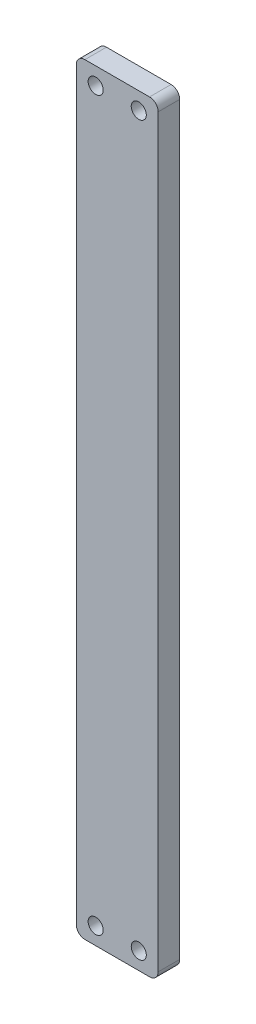
ISO-10303-21;
HEADER;
FILE_DESCRIPTION(('STEP AP214'),'2;1');
FILE_NAME('part.step','',(''),(''),'','','');
FILE_SCHEMA(('AUTOMOTIVE_DESIGN { 1 0 10303 214 1 1 1 1 }'));
ENDSEC;
DATA;
#1=APPLICATION_CONTEXT('core data for automotive mechanical design processes');
#2=APPLICATION_PROTOCOL_DEFINITION('international standard','automotive_design',2000,#1);
#3=PRODUCT_CONTEXT('',#1,'mechanical');
#4=PRODUCT('Part','Part','',(#3));
#5=PRODUCT_RELATED_PRODUCT_CATEGORY('part','',(#4));
#6=PRODUCT_DEFINITION_FORMATION('','',#4);
#7=PRODUCT_DEFINITION_CONTEXT('part definition',#1,'design');
#8=PRODUCT_DEFINITION('design','',#6,#7);
#9=PRODUCT_DEFINITION_SHAPE('','',#8);
#10=(LENGTH_UNIT() NAMED_UNIT(*) SI_UNIT(.MILLI.,.METRE.));
#11=(NAMED_UNIT(*) PLANE_ANGLE_UNIT() SI_UNIT($,.RADIAN.));
#12=(NAMED_UNIT(*) SI_UNIT($,.STERADIAN.) SOLID_ANGLE_UNIT());
#13=UNCERTAINTY_MEASURE_WITH_UNIT(LENGTH_MEASURE(1.E-05),#10,'distance_accuracy_value','');
#14=(GEOMETRIC_REPRESENTATION_CONTEXT(3) GLOBAL_UNCERTAINTY_ASSIGNED_CONTEXT((#13)) GLOBAL_UNIT_ASSIGNED_CONTEXT((#10,
#11,#12)) REPRESENTATION_CONTEXT('',''));
#15=CARTESIAN_POINT('',(0.,0.,0.));
#16=DIRECTION('',(0.,0.,1.));
#17=DIRECTION('',(1.,0.,0.));
#18=AXIS2_PLACEMENT_3D('',#15,#16,#17);
#19=CARTESIAN_POINT('',(-7.49999999999694,-179.270297721339,5.));
#20=DIRECTION('',(0.,0.,-1.));
#21=DIRECTION('',(-1.,0.,0.));
#22=AXIS2_PLACEMENT_3D('',#19,#20,#21);
#23=PLANE('',#22);
#24=CARTESIAN_POINT('',(-7.49999999999694,-179.270297721339,5.));
#25=DIRECTION('',(0.,0.,1.));
#26=DIRECTION('',(-1.,0.,0.));
#27=AXIS2_PLACEMENT_3D('',#24,#25,#26);
#28=CIRCLE('',#27,2.00000000000002);
#29=CARTESIAN_POINT('',(-9.49999999999696,-179.270297721339,5.));
#30=VERTEX_POINT('',#29);
#31=CARTESIAN_POINT('',(-7.49999999999694,-181.270297721339,5.));
#32=VERTEX_POINT('',#31);
#33=EDGE_CURVE('E168',#30,#32,#28,.T.);
#34=ORIENTED_EDGE('',*,*,#33,.T.);
#35=DIRECTION('',(1.,0.,0.));
#36=VECTOR('',#35,1.);
#37=CARTESIAN_POINT('',(-7.49999999999694,-181.270297721339,5.));
#38=LINE('',#37,#36);
#39=CARTESIAN_POINT('',(7.50000000000305,-181.270297721339,5.));
#40=VERTEX_POINT('',#39);
#41=EDGE_CURVE('E104',#32,#40,#38,.T.);
#42=ORIENTED_EDGE('',*,*,#41,.T.);
#43=CARTESIAN_POINT('',(7.50000000000305,-179.270297721339,5.));
#44=DIRECTION('',(0.,0.,1.));
#45=DIRECTION('',(1.,0.,0.));
#46=AXIS2_PLACEMENT_3D('',#43,#44,#45);
#47=CIRCLE('',#46,2.);
#48=CARTESIAN_POINT('',(9.50000000000304,-179.270297721339,5.));
#49=VERTEX_POINT('',#48);
#50=EDGE_CURVE('E189',#40,#49,#47,.T.);
#51=ORIENTED_EDGE('',*,*,#50,.T.);
#52=DIRECTION('',(0.,1.,0.));
#53=VECTOR('',#52,1.);
#54=CARTESIAN_POINT('',(9.50000000000304,-179.270297721339,5.));
#55=LINE('',#54,#53);
#56=CARTESIAN_POINT('',(9.50000000000304,-6.42970227866077,5.));
#57=VERTEX_POINT('',#56);
#58=EDGE_CURVE('E203',#49,#57,#55,.T.);
#59=ORIENTED_EDGE('',*,*,#58,.T.);
#60=CARTESIAN_POINT('',(7.50000000000304,-6.42970227866076,5.));
#61=DIRECTION('',(0.,0.,1.));
#62=DIRECTION('',(-1.,0.,0.));
#63=AXIS2_PLACEMENT_3D('',#60,#61,#62);
#64=CIRCLE('',#63,2.);
#65=CARTESIAN_POINT('',(7.50000000000303,-4.42970227866076,5.));
#66=VERTEX_POINT('',#65);
#67=EDGE_CURVE('E123',#57,#66,#64,.T.);
#68=ORIENTED_EDGE('',*,*,#67,.T.);
#69=DIRECTION('',(-1.,0.,0.));
#70=VECTOR('',#69,1.);
#71=CARTESIAN_POINT('',(-7.49999999999694,-4.42970227866076,5.));
#72=LINE('',#71,#70);
#73=CARTESIAN_POINT('',(-7.49999999999694,-4.42970227866076,5.));
#74=VERTEX_POINT('',#73);
#75=EDGE_CURVE('E117',#66,#74,#72,.T.);
#76=ORIENTED_EDGE('',*,*,#75,.T.);
#77=CARTESIAN_POINT('',(-7.49999999999696,-6.42970227866076,5.));
#78=DIRECTION('',(0.,0.,1.));
#79=DIRECTION('',(1.,0.,0.));
#80=AXIS2_PLACEMENT_3D('',#77,#78,#79);
#81=CIRCLE('',#80,2.);
#82=CARTESIAN_POINT('',(-9.49999999999696,-6.42970227866077,5.));
#83=VERTEX_POINT('',#82);
#84=EDGE_CURVE('E121',#74,#83,#81,.T.);
#85=ORIENTED_EDGE('',*,*,#84,.T.);
#86=DIRECTION('',(0.,-1.,0.));
#87=VECTOR('',#86,1.);
#88=CARTESIAN_POINT('',(-9.49999999999696,-179.270297721339,5.));
#89=LINE('',#88,#87);
#90=EDGE_CURVE('E61',#83,#30,#89,.T.);
#91=ORIENTED_EDGE('',*,*,#90,.T.);
#92=EDGE_LOOP('',(#34,#42,#51,#59,#68,#76,#85,#91));
#93=FACE_BOUND('',#92,.T.);
#94=CARTESIAN_POINT('',(5.00000000000315,-8.42970227866076,5.));
#95=DIRECTION('',(0.,0.,1.));
#96=DIRECTION('',(1.,0.,0.));
#97=AXIS2_PLACEMENT_3D('',#94,#95,#96);
#98=CIRCLE('',#97,1.75);
#99=CARTESIAN_POINT('',(6.75000000000315,-8.42970227866076,5.));
#100=VERTEX_POINT('',#99);
#101=EDGE_CURVE('E150',#100,#100,#98,.T.);
#102=ORIENTED_EDGE('',*,*,#101,.F.);
#103=EDGE_LOOP('',(#102));
#104=FACE_BOUND('',#103,.T.);
#105=CARTESIAN_POINT('',(-4.99999999999685,-8.42970227866076,5.));
#106=DIRECTION('',(0.,0.,1.));
#107=DIRECTION('',(1.,0.,0.));
#108=AXIS2_PLACEMENT_3D('',#105,#106,#107);
#109=CIRCLE('',#108,1.75);
#110=CARTESIAN_POINT('',(-3.24999999999685,-8.42970227866076,5.));
#111=VERTEX_POINT('',#110);
#112=EDGE_CURVE('E217',#111,#111,#109,.T.);
#113=ORIENTED_EDGE('',*,*,#112,.F.);
#114=EDGE_LOOP('',(#113));
#115=FACE_BOUND('',#114,.T.);
#116=CARTESIAN_POINT('',(-4.99999999999684,-177.270297721339,5.));
#117=DIRECTION('',(0.,0.,1.));
#118=DIRECTION('',(-1.,0.,0.));
#119=AXIS2_PLACEMENT_3D('',#116,#117,#118);
#120=CIRCLE('',#119,1.75000000000001);
#121=CARTESIAN_POINT('',(-6.74999999999685,-177.270297721339,5.));
#122=VERTEX_POINT('',#121);
#123=EDGE_CURVE('E225',#122,#122,#120,.T.);
#124=ORIENTED_EDGE('',*,*,#123,.F.);
#125=EDGE_LOOP('',(#124));
#126=FACE_BOUND('',#125,.T.);
#127=CARTESIAN_POINT('',(5.00000000000316,-177.270297721339,5.));
#128=DIRECTION('',(0.,0.,1.));
#129=DIRECTION('',(-1.,0.,0.));
#130=AXIS2_PLACEMENT_3D('',#127,#128,#129);
#131=CIRCLE('',#130,1.75);
#132=CARTESIAN_POINT('',(3.25000000000316,-177.270297721339,5.));
#133=VERTEX_POINT('',#132);
#134=EDGE_CURVE('E233',#133,#133,#131,.T.);
#135=ORIENTED_EDGE('',*,*,#134,.F.);
#136=EDGE_LOOP('',(#135));
#137=FACE_BOUND('',#136,.T.);
#138=ADVANCED_FACE('F43',(#93,#104,#115,#126,#137),#23,.F.);
#139=CARTESIAN_POINT('',(-7.49999999999694,-179.270297721339,0.));
#140=DIRECTION('',(0.,0.,-1.));
#141=DIRECTION('',(-1.,0.,0.));
#142=AXIS2_PLACEMENT_3D('',#139,#140,#141);
#143=PLANE('',#142);
#144=CARTESIAN_POINT('',(-4.99999999999684,-177.270297721339,0.));
#145=DIRECTION('',(0.,0.,1.));
#146=DIRECTION('',(-1.,0.,0.));
#147=AXIS2_PLACEMENT_3D('',#144,#145,#146);
#148=CIRCLE('',#147,1.75000000000001);
#149=CARTESIAN_POINT('',(-6.74999999999685,-177.270297721339,0.));
#150=VERTEX_POINT('',#149);
#151=EDGE_CURVE('E229',#150,#150,#148,.T.);
#152=ORIENTED_EDGE('',*,*,#151,.T.);
#153=EDGE_LOOP('',(#152));
#154=FACE_BOUND('',#153,.T.);
#155=CARTESIAN_POINT('',(5.00000000000315,-8.42970227866076,0.));
#156=DIRECTION('',(0.,0.,1.));
#157=DIRECTION('',(1.,0.,0.));
#158=AXIS2_PLACEMENT_3D('',#155,#156,#157);
#159=CIRCLE('',#158,1.75);
#160=CARTESIAN_POINT('',(6.75000000000315,-8.42970227866076,0.));
#161=VERTEX_POINT('',#160);
#162=EDGE_CURVE('E213',#161,#161,#159,.T.);
#163=ORIENTED_EDGE('',*,*,#162,.T.);
#164=EDGE_LOOP('',(#163));
#165=FACE_BOUND('',#164,.T.);
#166=CARTESIAN_POINT('',(-7.49999999999694,-179.270297721339,0.));
#167=DIRECTION('',(0.,0.,1.));
#168=DIRECTION('',(-1.,0.,0.));
#169=AXIS2_PLACEMENT_3D('',#166,#167,#168);
#170=CIRCLE('',#169,2.00000000000002);
#171=CARTESIAN_POINT('',(-9.49999999999696,-179.270297721339,0.));
#172=VERTEX_POINT('',#171);
#173=CARTESIAN_POINT('',(-7.49999999999694,-181.270297721339,0.));
#174=VERTEX_POINT('',#173);
#175=EDGE_CURVE('E145',#172,#174,#170,.T.);
#176=ORIENTED_EDGE('',*,*,#175,.F.);
#177=DIRECTION('',(0.,-1.,0.));
#178=VECTOR('',#177,1.);
#179=CARTESIAN_POINT('',(-9.49999999999696,-179.270297721339,0.));
#180=LINE('',#179,#178);
#181=CARTESIAN_POINT('',(-9.49999999999696,-6.42970227866077,0.));
#182=VERTEX_POINT('',#181);
#183=EDGE_CURVE('E96',#182,#172,#180,.T.);
#184=ORIENTED_EDGE('',*,*,#183,.F.);
#185=CARTESIAN_POINT('',(-7.49999999999696,-6.42970227866076,0.));
#186=DIRECTION('',(0.,0.,1.));
#187=DIRECTION('',(1.,0.,0.));
#188=AXIS2_PLACEMENT_3D('',#185,#186,#187);
#189=CIRCLE('',#188,2.);
#190=CARTESIAN_POINT('',(-7.49999999999694,-4.42970227866076,0.));
#191=VERTEX_POINT('',#190);
#192=EDGE_CURVE('E90',#191,#182,#189,.T.);
#193=ORIENTED_EDGE('',*,*,#192,.F.);
#194=DIRECTION('',(-1.,0.,0.));
#195=VECTOR('',#194,1.);
#196=CARTESIAN_POINT('',(-7.49999999999694,-4.42970227866076,0.));
#197=LINE('',#196,#195);
#198=CARTESIAN_POINT('',(7.50000000000303,-4.42970227866076,0.));
#199=VERTEX_POINT('',#198);
#200=EDGE_CURVE('E132',#199,#191,#197,.T.);
#201=ORIENTED_EDGE('',*,*,#200,.F.);
#202=CARTESIAN_POINT('',(7.50000000000304,-6.42970227866076,0.));
#203=DIRECTION('',(0.,0.,1.));
#204=DIRECTION('',(-1.,0.,0.));
#205=AXIS2_PLACEMENT_3D('',#202,#203,#204);
#206=CIRCLE('',#205,2.);
#207=CARTESIAN_POINT('',(9.50000000000304,-6.42970227866077,0.));
#208=VERTEX_POINT('',#207);
#209=EDGE_CURVE('E159',#208,#199,#206,.T.);
#210=ORIENTED_EDGE('',*,*,#209,.F.);
#211=DIRECTION('',(0.,1.,0.));
#212=VECTOR('',#211,1.);
#213=CARTESIAN_POINT('',(9.50000000000304,-179.270297721339,0.));
#214=LINE('',#213,#212);
#215=CARTESIAN_POINT('',(9.50000000000304,-179.270297721339,0.));
#216=VERTEX_POINT('',#215);
#217=EDGE_CURVE('E156',#216,#208,#214,.T.);
#218=ORIENTED_EDGE('',*,*,#217,.F.);
#219=CARTESIAN_POINT('',(7.50000000000305,-179.270297721339,0.));
#220=DIRECTION('',(0.,0.,1.));
#221=DIRECTION('',(1.,0.,0.));
#222=AXIS2_PLACEMENT_3D('',#219,#220,#221);
#223=CIRCLE('',#222,2.);
#224=CARTESIAN_POINT('',(7.50000000000305,-181.270297721339,0.));
#225=VERTEX_POINT('',#224);
#226=EDGE_CURVE('E153',#225,#216,#223,.T.);
#227=ORIENTED_EDGE('',*,*,#226,.F.);
#228=DIRECTION('',(1.,0.,0.));
#229=VECTOR('',#228,1.);
#230=CARTESIAN_POINT('',(-7.49999999999694,-181.270297721339,0.));
#231=LINE('',#230,#229);
#232=EDGE_CURVE('E149',#174,#225,#231,.T.);
#233=ORIENTED_EDGE('',*,*,#232,.F.);
#234=EDGE_LOOP('',(#176,#184,#193,#201,#210,#218,#227,#233));
#235=FACE_BOUND('',#234,.T.);
#236=CARTESIAN_POINT('',(-4.99999999999685,-8.42970227866076,0.));
#237=DIRECTION('',(0.,0.,1.));
#238=DIRECTION('',(1.,0.,0.));
#239=AXIS2_PLACEMENT_3D('',#236,#237,#238);
#240=CIRCLE('',#239,1.75);
#241=CARTESIAN_POINT('',(-3.24999999999685,-8.42970227866076,0.));
#242=VERTEX_POINT('',#241);
#243=EDGE_CURVE('E221',#242,#242,#240,.T.);
#244=ORIENTED_EDGE('',*,*,#243,.T.);
#245=EDGE_LOOP('',(#244));
#246=FACE_BOUND('',#245,.T.);
#247=CARTESIAN_POINT('',(5.00000000000316,-177.270297721339,0.));
#248=DIRECTION('',(0.,0.,1.));
#249=DIRECTION('',(-1.,0.,0.));
#250=AXIS2_PLACEMENT_3D('',#247,#248,#249);
#251=CIRCLE('',#250,1.75);
#252=CARTESIAN_POINT('',(3.25000000000316,-177.270297721339,0.));
#253=VERTEX_POINT('',#252);
#254=EDGE_CURVE('E237',#253,#253,#251,.T.);
#255=ORIENTED_EDGE('',*,*,#254,.T.);
#256=EDGE_LOOP('',(#255));
#257=FACE_BOUND('',#256,.T.);
#258=ADVANCED_FACE('F193',(#154,#165,#235,#246,#257),#143,.T.);
#259=CARTESIAN_POINT('',(-7.49999999999694,-179.270297721339,5.));
#260=DIRECTION('',(0.,0.,-1.));
#261=DIRECTION('',(-1.,0.,0.));
#262=AXIS2_PLACEMENT_3D('',#259,#260,#261);
#263=CYLINDRICAL_SURFACE('',#262,2.00000000000002);
#264=ORIENTED_EDGE('',*,*,#175,.T.);
#265=DIRECTION('',(0.,0.,-1.));
#266=VECTOR('',#265,1.);
#267=CARTESIAN_POINT('',(-7.49999999999694,-181.270297721339,5.));
#268=LINE('',#267,#266);
#269=EDGE_CURVE('E11',#32,#174,#268,.T.);
#270=ORIENTED_EDGE('',*,*,#269,.F.);
#271=ORIENTED_EDGE('',*,*,#33,.F.);
#272=DIRECTION('',(0.,0.,-1.));
#273=VECTOR('',#272,1.);
#274=CARTESIAN_POINT('',(-9.49999999999696,-179.270297721339,5.));
#275=LINE('',#274,#273);
#276=EDGE_CURVE('E141',#30,#172,#275,.T.);
#277=ORIENTED_EDGE('',*,*,#276,.T.);
#278=EDGE_LOOP('',(#264,#270,#271,#277));
#279=FACE_BOUND('',#278,.T.);
#280=ADVANCED_FACE('F45',(#279),#263,.T.);
#281=CARTESIAN_POINT('',(-7.49999999999694,-181.270297721339,5.));
#282=DIRECTION('',(0.,1.,0.));
#283=DIRECTION('',(0.,0.,1.));
#284=AXIS2_PLACEMENT_3D('',#281,#282,#283);
#285=PLANE('',#284);
#286=ORIENTED_EDGE('',*,*,#232,.T.);
#287=DIRECTION('',(0.,0.,-1.));
#288=VECTOR('',#287,1.);
#289=CARTESIAN_POINT('',(7.50000000000305,-181.270297721339,5.));
#290=LINE('',#289,#288);
#291=EDGE_CURVE('E53',#40,#225,#290,.T.);
#292=ORIENTED_EDGE('',*,*,#291,.F.);
#293=ORIENTED_EDGE('',*,*,#41,.F.);
#294=ORIENTED_EDGE('',*,*,#269,.T.);
#295=EDGE_LOOP('',(#286,#292,#293,#294));
#296=FACE_BOUND('',#295,.T.);
#297=ADVANCED_FACE('F271',(#296),#285,.F.);
#298=CARTESIAN_POINT('',(7.50000000000305,-179.270297721339,5.));
#299=DIRECTION('',(0.,0.,-1.));
#300=DIRECTION('',(-1.,0.,0.));
#301=AXIS2_PLACEMENT_3D('',#298,#299,#300);
#302=CYLINDRICAL_SURFACE('',#301,2.);
#303=ORIENTED_EDGE('',*,*,#226,.T.);
#304=DIRECTION('',(0.,0.,-1.));
#305=VECTOR('',#304,1.);
#306=CARTESIAN_POINT('',(9.50000000000304,-179.270297721339,5.));
#307=LINE('',#306,#305);
#308=EDGE_CURVE('E179',#49,#216,#307,.T.);
#309=ORIENTED_EDGE('',*,*,#308,.F.);
#310=ORIENTED_EDGE('',*,*,#50,.F.);
#311=ORIENTED_EDGE('',*,*,#291,.T.);
#312=EDGE_LOOP('',(#303,#309,#310,#311));
#313=FACE_BOUND('',#312,.T.);
#314=ADVANCED_FACE('F187',(#313),#302,.T.);
#315=CARTESIAN_POINT('',(9.50000000000304,-179.270297721339,5.));
#316=DIRECTION('',(-1.,0.,0.));
#317=DIRECTION('',(0.,-1.,0.));
#318=AXIS2_PLACEMENT_3D('',#315,#316,#317);
#319=PLANE('',#318);
#320=ORIENTED_EDGE('',*,*,#217,.T.);
#321=DIRECTION('',(0.,0.,-1.));
#322=VECTOR('',#321,1.);
#323=CARTESIAN_POINT('',(9.50000000000304,-6.42970227866077,5.));
#324=LINE('',#323,#322);
#325=EDGE_CURVE('E175',#57,#208,#324,.T.);
#326=ORIENTED_EDGE('',*,*,#325,.F.);
#327=ORIENTED_EDGE('',*,*,#58,.F.);
#328=ORIENTED_EDGE('',*,*,#308,.T.);
#329=EDGE_LOOP('',(#320,#326,#327,#328));
#330=FACE_BOUND('',#329,.T.);
#331=ADVANCED_FACE('F198',(#330),#319,.F.);
#332=CARTESIAN_POINT('',(7.50000000000304,-6.42970227866076,5.));
#333=DIRECTION('',(0.,0.,-1.));
#334=DIRECTION('',(-1.,0.,0.));
#335=AXIS2_PLACEMENT_3D('',#332,#333,#334);
#336=CYLINDRICAL_SURFACE('',#335,2.);
#337=ORIENTED_EDGE('',*,*,#209,.T.);
#338=DIRECTION('',(0.,0.,-1.));
#339=VECTOR('',#338,1.);
#340=CARTESIAN_POINT('',(7.50000000000303,-4.42970227866076,5.));
#341=LINE('',#340,#339);
#342=EDGE_CURVE('E134',#66,#199,#341,.T.);
#343=ORIENTED_EDGE('',*,*,#342,.F.);
#344=ORIENTED_EDGE('',*,*,#67,.F.);
#345=ORIENTED_EDGE('',*,*,#325,.T.);
#346=EDGE_LOOP('',(#337,#343,#344,#345));
#347=FACE_BOUND('',#346,.T.);
#348=ADVANCED_FACE('F201',(#347),#336,.T.);
#349=CARTESIAN_POINT('',(-7.49999999999694,-4.42970227866076,5.));
#350=DIRECTION('',(0.,-1.,0.));
#351=DIRECTION('',(0.,0.,-1.));
#352=AXIS2_PLACEMENT_3D('',#349,#350,#351);
#353=PLANE('',#352);
#354=ORIENTED_EDGE('',*,*,#200,.T.);
#355=DIRECTION('',(0.,0.,-1.));
#356=VECTOR('',#355,1.);
#357=CARTESIAN_POINT('',(-7.49999999999694,-4.42970227866076,5.));
#358=LINE('',#357,#356);
#359=EDGE_CURVE('E129',#74,#191,#358,.T.);
#360=ORIENTED_EDGE('',*,*,#359,.F.);
#361=ORIENTED_EDGE('',*,*,#75,.F.);
#362=ORIENTED_EDGE('',*,*,#342,.T.);
#363=EDGE_LOOP('',(#354,#360,#361,#362));
#364=FACE_BOUND('',#363,.T.);
#365=ADVANCED_FACE('F130',(#364),#353,.F.);
#366=CARTESIAN_POINT('',(-7.49999999999696,-6.42970227866076,5.));
#367=DIRECTION('',(0.,0.,-1.));
#368=DIRECTION('',(-1.,0.,0.));
#369=AXIS2_PLACEMENT_3D('',#366,#367,#368);
#370=CYLINDRICAL_SURFACE('',#369,2.);
#371=ORIENTED_EDGE('',*,*,#192,.T.);
#372=DIRECTION('',(0.,0.,-1.));
#373=VECTOR('',#372,1.);
#374=CARTESIAN_POINT('',(-9.49999999999696,-6.42970227866077,5.));
#375=LINE('',#374,#373);
#376=EDGE_CURVE('E135',#83,#182,#375,.T.);
#377=ORIENTED_EDGE('',*,*,#376,.F.);
#378=ORIENTED_EDGE('',*,*,#84,.F.);
#379=ORIENTED_EDGE('',*,*,#359,.T.);
#380=EDGE_LOOP('',(#371,#377,#378,#379));
#381=FACE_BOUND('',#380,.T.);
#382=ADVANCED_FACE('F137',(#381),#370,.T.);
#383=CARTESIAN_POINT('',(-9.49999999999696,-179.270297721339,5.));
#384=DIRECTION('',(1.,0.,0.));
#385=DIRECTION('',(0.,1.,0.));
#386=AXIS2_PLACEMENT_3D('',#383,#384,#385);
#387=PLANE('',#386);
#388=ORIENTED_EDGE('',*,*,#183,.T.);
#389=ORIENTED_EDGE('',*,*,#276,.F.);
#390=ORIENTED_EDGE('',*,*,#90,.F.);
#391=ORIENTED_EDGE('',*,*,#376,.T.);
#392=EDGE_LOOP('',(#388,#389,#390,#391));
#393=FACE_BOUND('',#392,.T.);
#394=ADVANCED_FACE('F259',(#393),#387,.F.);
#395=CARTESIAN_POINT('',(5.00000000000315,-8.42970227866076,5.));
#396=DIRECTION('',(0.,0.,-1.));
#397=DIRECTION('',(-1.,0.,0.));
#398=AXIS2_PLACEMENT_3D('',#395,#396,#397);
#399=CYLINDRICAL_SURFACE('',#398,1.75);
#400=ORIENTED_EDGE('',*,*,#101,.T.);
#401=EDGE_LOOP('',(#400));
#402=FACE_BOUND('',#401,.T.);
#403=ORIENTED_EDGE('',*,*,#162,.F.);
#404=EDGE_LOOP('',(#403));
#405=FACE_BOUND('',#404,.T.);
#406=ADVANCED_FACE('F256',(#402,#405),#399,.F.);
#407=CARTESIAN_POINT('',(-4.99999999999685,-8.42970227866076,5.));
#408=DIRECTION('',(0.,0.,-1.));
#409=DIRECTION('',(-1.,0.,0.));
#410=AXIS2_PLACEMENT_3D('',#407,#408,#409);
#411=CYLINDRICAL_SURFACE('',#410,1.75);
#412=ORIENTED_EDGE('',*,*,#112,.T.);
#413=EDGE_LOOP('',(#412));
#414=FACE_BOUND('',#413,.T.);
#415=ORIENTED_EDGE('',*,*,#243,.F.);
#416=EDGE_LOOP('',(#415));
#417=FACE_BOUND('',#416,.T.);
#418=ADVANCED_FACE('F347',(#414,#417),#411,.F.);
#419=CARTESIAN_POINT('',(-4.99999999999684,-177.270297721339,5.));
#420=DIRECTION('',(0.,0.,-1.));
#421=DIRECTION('',(-1.,0.,0.));
#422=AXIS2_PLACEMENT_3D('',#419,#420,#421);
#423=CYLINDRICAL_SURFACE('',#422,1.75000000000001);
#424=ORIENTED_EDGE('',*,*,#123,.T.);
#425=EDGE_LOOP('',(#424));
#426=FACE_BOUND('',#425,.T.);
#427=ORIENTED_EDGE('',*,*,#151,.F.);
#428=EDGE_LOOP('',(#427));
#429=FACE_BOUND('',#428,.T.);
#430=ADVANCED_FACE('F356',(#426,#429),#423,.F.);
#431=CARTESIAN_POINT('',(5.00000000000316,-177.270297721339,5.));
#432=DIRECTION('',(0.,0.,-1.));
#433=DIRECTION('',(-1.,0.,0.));
#434=AXIS2_PLACEMENT_3D('',#431,#432,#433);
#435=CYLINDRICAL_SURFACE('',#434,1.75);
#436=ORIENTED_EDGE('',*,*,#134,.T.);
#437=EDGE_LOOP('',(#436));
#438=FACE_BOUND('',#437,.T.);
#439=ORIENTED_EDGE('',*,*,#254,.F.);
#440=EDGE_LOOP('',(#439));
#441=FACE_BOUND('',#440,.T.);
#442=ADVANCED_FACE('F245',(#438,#441),#435,.F.);
#443=CLOSED_SHELL('',(#138,#258,#280,#297,#314,#331,#348,#365,#382,#394,#406,#418,#430,#442));
#444=MANIFOLD_SOLID_BREP('B2',#443);
#445=ADVANCED_BREP_SHAPE_REPRESENTATION('',(#18,#444),#14);
#446=SHAPE_DEFINITION_REPRESENTATION(#9,#445);
ENDSEC;
END-ISO-10303-21;
